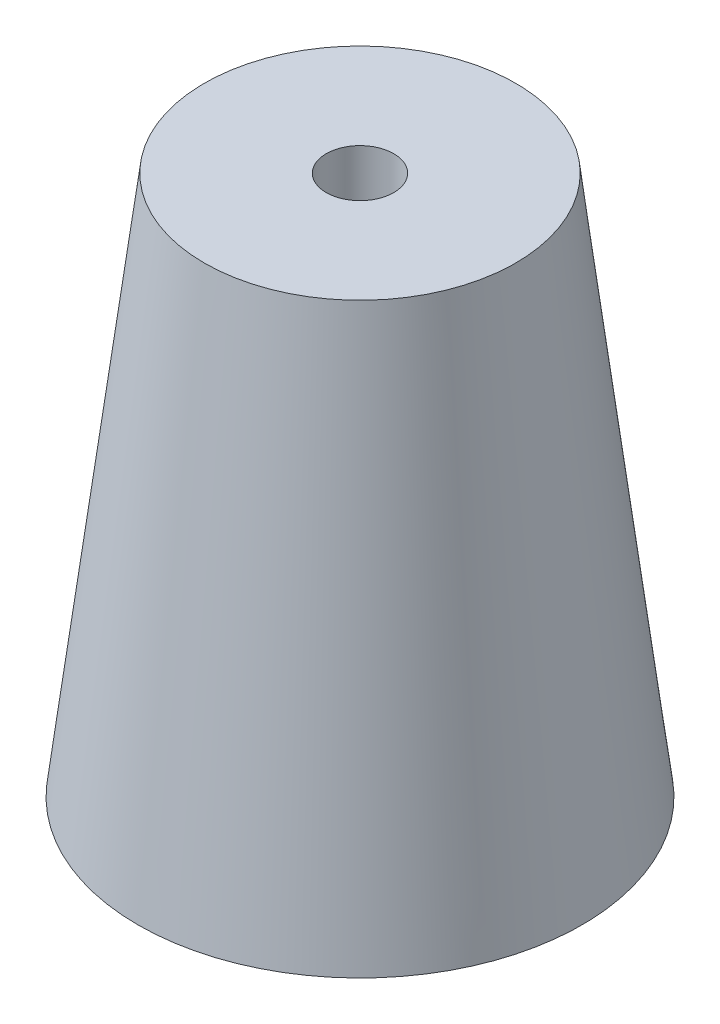
ISO-10303-21;
HEADER;
FILE_DESCRIPTION(('STEP AP214'),'2;1');
FILE_NAME('part.step','',(''),(''),'','','');
FILE_SCHEMA(('AUTOMOTIVE_DESIGN { 1 0 10303 214 1 1 1 1 }'));
ENDSEC;
DATA;
#1=APPLICATION_CONTEXT('core data for automotive mechanical design processes');
#2=APPLICATION_PROTOCOL_DEFINITION('international standard','automotive_design',2000,#1);
#3=PRODUCT_CONTEXT('',#1,'mechanical');
#4=PRODUCT('Part','Part','',(#3));
#5=PRODUCT_RELATED_PRODUCT_CATEGORY('part','',(#4));
#6=PRODUCT_DEFINITION_FORMATION('','',#4);
#7=PRODUCT_DEFINITION_CONTEXT('part definition',#1,'design');
#8=PRODUCT_DEFINITION('design','',#6,#7);
#9=PRODUCT_DEFINITION_SHAPE('','',#8);
#10=(LENGTH_UNIT() NAMED_UNIT(*) SI_UNIT(.MILLI.,.METRE.));
#11=(NAMED_UNIT(*) PLANE_ANGLE_UNIT() SI_UNIT($,.RADIAN.));
#12=(NAMED_UNIT(*) SI_UNIT($,.STERADIAN.) SOLID_ANGLE_UNIT());
#13=UNCERTAINTY_MEASURE_WITH_UNIT(LENGTH_MEASURE(1.E-05),#10,'distance_accuracy_value','');
#14=(GEOMETRIC_REPRESENTATION_CONTEXT(3) GLOBAL_UNCERTAINTY_ASSIGNED_CONTEXT((#13)) GLOBAL_UNIT_ASSIGNED_CONTEXT((#10,
#11,#12)) REPRESENTATION_CONTEXT('',''));
#15=CARTESIAN_POINT('',(0.,0.,0.));
#16=DIRECTION('',(0.,0.,1.));
#17=DIRECTION('',(1.,0.,0.));
#18=AXIS2_PLACEMENT_3D('',#15,#16,#17);
#19=CARTESIAN_POINT('',(0.,0.,0.));
#20=DIRECTION('',(0.,-1.,0.));
#21=DIRECTION('',(0.,0.,1.));
#22=AXIS2_PLACEMENT_3D('',#19,#20,#21);
#23=CONICAL_SURFACE('',#22,23.495,0.122173047639603);
#24=CARTESIAN_POINT('',(0.,57.15,0.));
#25=DIRECTION('',(0.,1.,0.));
#26=DIRECTION('',(0.,0.,1.));
#27=AXIS2_PLACEMENT_3D('',#24,#25,#26);
#28=CIRCLE('',#27,16.477862344399);
#29=CARTESIAN_POINT('',(0.,57.15,16.477862344399));
#30=VERTEX_POINT('',#29);
#31=EDGE_CURVE('E10',#30,#30,#28,.T.);
#32=ORIENTED_EDGE('',*,*,#31,.F.);
#33=EDGE_LOOP('',(#32));
#34=FACE_BOUND('',#33,.T.);
#35=CARTESIAN_POINT('',(0.,0.,0.));
#36=DIRECTION('',(0.,1.,0.));
#37=DIRECTION('',(0.,0.,1.));
#38=AXIS2_PLACEMENT_3D('',#35,#36,#37);
#39=CIRCLE('',#38,23.495);
#40=CARTESIAN_POINT('',(0.,0.,23.495));
#41=VERTEX_POINT('',#40);
#42=EDGE_CURVE('E41',#41,#41,#39,.T.);
#43=ORIENTED_EDGE('',*,*,#42,.T.);
#44=EDGE_LOOP('',(#43));
#45=FACE_BOUND('',#44,.T.);
#46=ADVANCED_FACE('F35',(#34,#45),#23,.T.);
#47=CARTESIAN_POINT('',(0.,57.15,0.));
#48=DIRECTION('',(0.,1.,0.));
#49=DIRECTION('',(0.,0.,1.));
#50=AXIS2_PLACEMENT_3D('',#47,#48,#49);
#51=PLANE('',#50);
#52=CARTESIAN_POINT('',(0.,57.15,0.));
#53=DIRECTION('',(0.,-1.,0.));
#54=DIRECTION('',(0.,0.,-1.));
#55=AXIS2_PLACEMENT_3D('',#52,#53,#54);
#56=CIRCLE('',#55,3.57123999999999);
#57=CARTESIAN_POINT('',(0.,57.15,-3.57123999999999));
#58=VERTEX_POINT('',#57);
#59=EDGE_CURVE('E45',#58,#58,#56,.T.);
#60=ORIENTED_EDGE('',*,*,#59,.T.);
#61=EDGE_LOOP('',(#60));
#62=FACE_BOUND('',#61,.T.);
#63=ORIENTED_EDGE('',*,*,#31,.T.);
#64=EDGE_LOOP('',(#63));
#65=FACE_BOUND('',#64,.T.);
#66=ADVANCED_FACE('F60',(#62,#65),#51,.T.);
#67=CARTESIAN_POINT('',(0.,0.,0.));
#68=DIRECTION('',(0.,1.,0.));
#69=DIRECTION('',(0.,0.,1.));
#70=AXIS2_PLACEMENT_3D('',#67,#68,#69);
#71=PLANE('',#70);
#72=CARTESIAN_POINT('',(0.,0.,0.));
#73=DIRECTION('',(0.,-1.,0.));
#74=DIRECTION('',(0.,0.,-1.));
#75=AXIS2_PLACEMENT_3D('',#72,#73,#74);
#76=CIRCLE('',#75,3.57123999999999);
#77=CARTESIAN_POINT('',(0.,0.,-3.57123999999999));
#78=VERTEX_POINT('',#77);
#79=EDGE_CURVE('E49',#78,#78,#76,.T.);
#80=ORIENTED_EDGE('',*,*,#79,.F.);
#81=EDGE_LOOP('',(#80));
#82=FACE_BOUND('',#81,.T.);
#83=ORIENTED_EDGE('',*,*,#42,.F.);
#84=EDGE_LOOP('',(#83));
#85=FACE_BOUND('',#84,.T.);
#86=ADVANCED_FACE('F57',(#82,#85),#71,.F.);
#87=CARTESIAN_POINT('',(0.,0.,0.));
#88=DIRECTION('',(0.,-1.,0.));
#89=DIRECTION('',(0.,0.,-1.));
#90=AXIS2_PLACEMENT_3D('',#87,#88,#89);
#91=CYLINDRICAL_SURFACE('',#90,3.57123999999999);
#92=ORIENTED_EDGE('',*,*,#59,.F.);
#93=EDGE_LOOP('',(#92));
#94=FACE_BOUND('',#93,.T.);
#95=ORIENTED_EDGE('',*,*,#79,.T.);
#96=EDGE_LOOP('',(#95));
#97=FACE_BOUND('',#96,.T.);
#98=ADVANCED_FACE('F55',(#94,#97),#91,.F.);
#99=CLOSED_SHELL('',(#46,#66,#86,#98));
#100=MANIFOLD_SOLID_BREP('B2',#99);
#101=ADVANCED_BREP_SHAPE_REPRESENTATION('',(#18,#100),#14);
#102=SHAPE_DEFINITION_REPRESENTATION(#9,#101);
ENDSEC;
END-ISO-10303-21;
